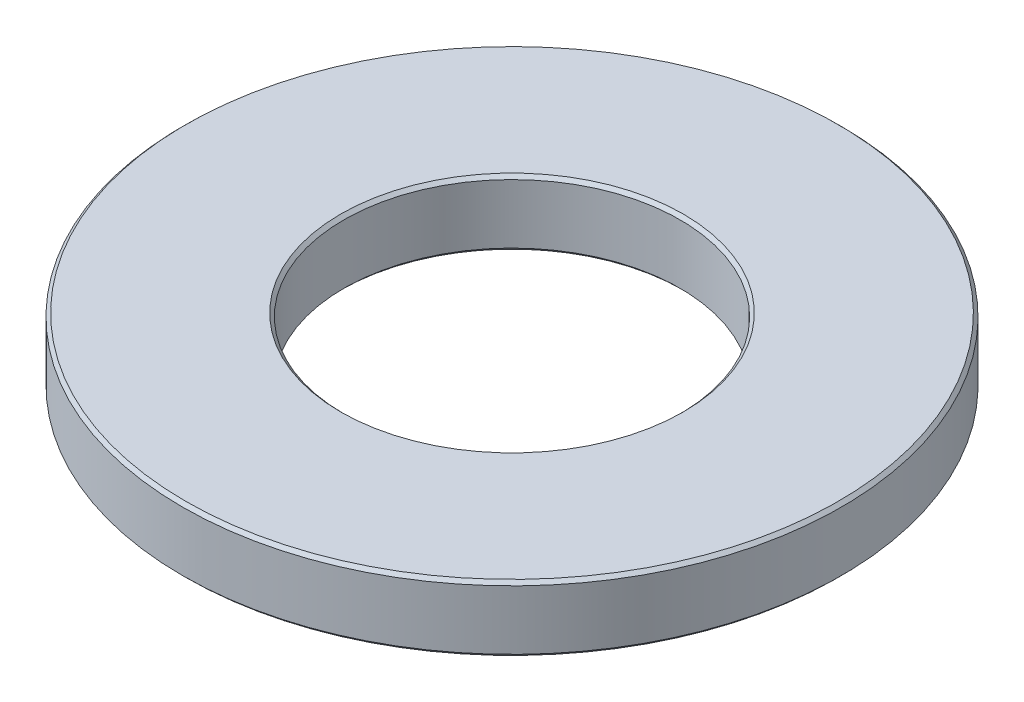
ISO-10303-21;
HEADER;
FILE_DESCRIPTION(('STEP AP214'),'2;1');
FILE_NAME('part.step','',(''),(''),'','','');
FILE_SCHEMA(('AUTOMOTIVE_DESIGN { 1 0 10303 214 1 1 1 1 }'));
ENDSEC;
DATA;
#1=APPLICATION_CONTEXT('core data for automotive mechanical design processes');
#2=APPLICATION_PROTOCOL_DEFINITION('international standard','automotive_design',2000,#1);
#3=PRODUCT_CONTEXT('',#1,'mechanical');
#4=PRODUCT('Part','Part','',(#3));
#5=PRODUCT_RELATED_PRODUCT_CATEGORY('part','',(#4));
#6=PRODUCT_DEFINITION_FORMATION('','',#4);
#7=PRODUCT_DEFINITION_CONTEXT('part definition',#1,'design');
#8=PRODUCT_DEFINITION('design','',#6,#7);
#9=PRODUCT_DEFINITION_SHAPE('','',#8);
#10=(LENGTH_UNIT() NAMED_UNIT(*) SI_UNIT(.MILLI.,.METRE.));
#11=(NAMED_UNIT(*) PLANE_ANGLE_UNIT() SI_UNIT($,.RADIAN.));
#12=(NAMED_UNIT(*) SI_UNIT($,.STERADIAN.) SOLID_ANGLE_UNIT());
#13=UNCERTAINTY_MEASURE_WITH_UNIT(LENGTH_MEASURE(1.E-05),#10,'distance_accuracy_value','');
#14=(GEOMETRIC_REPRESENTATION_CONTEXT(3) GLOBAL_UNCERTAINTY_ASSIGNED_CONTEXT((#13)) GLOBAL_UNIT_ASSIGNED_CONTEXT((#10,
#11,#12)) REPRESENTATION_CONTEXT('',''));
#15=CARTESIAN_POINT('',(0.,0.,0.));
#16=DIRECTION('',(0.,0.,1.));
#17=DIRECTION('',(1.,0.,0.));
#18=AXIS2_PLACEMENT_3D('',#15,#16,#17);
#19=CARTESIAN_POINT('',(0.,2.,0.));
#20=DIRECTION('',(0.,1.,0.));
#21=DIRECTION('',(0.,0.,1.));
#22=AXIS2_PLACEMENT_3D('',#19,#20,#21);
#23=PLANE('',#22);
#24=CARTESIAN_POINT('',(0.,2.,0.));
#25=DIRECTION('',(0.,1.,0.));
#26=DIRECTION('',(0.,0.,1.));
#27=AXIS2_PLACEMENT_3D('',#24,#25,#26);
#28=CIRCLE('',#27,5.2);
#29=CARTESIAN_POINT('',(0.,2.,5.2));
#30=VERTEX_POINT('',#29);
#31=EDGE_CURVE('E49',#30,#30,#28,.F.);
#32=ORIENTED_EDGE('',*,*,#31,.T.);
#33=EDGE_LOOP('',(#32));
#34=FACE_BOUND('',#33,.T.);
#35=CARTESIAN_POINT('',(0.,2.,0.));
#36=DIRECTION('',(0.,1.,0.));
#37=DIRECTION('',(0.,0.,1.));
#38=AXIS2_PLACEMENT_3D('',#35,#36,#37);
#39=CIRCLE('',#38,9.9);
#40=CARTESIAN_POINT('',(0.,2.,9.9));
#41=VERTEX_POINT('',#40);
#42=EDGE_CURVE('E52',#41,#41,#39,.T.);
#43=ORIENTED_EDGE('',*,*,#42,.T.);
#44=EDGE_LOOP('',(#43));
#45=FACE_BOUND('',#44,.T.);
#46=ADVANCED_FACE('F29',(#34,#45),#23,.T.);
#47=CARTESIAN_POINT('',(0.,0.,0.));
#48=DIRECTION('',(0.,1.,0.));
#49=DIRECTION('',(0.,0.,1.));
#50=AXIS2_PLACEMENT_3D('',#47,#48,#49);
#51=PLANE('',#50);
#52=CARTESIAN_POINT('',(0.,0.,0.));
#53=DIRECTION('',(0.,1.,0.));
#54=DIRECTION('',(0.,0.,1.));
#55=AXIS2_PLACEMENT_3D('',#52,#53,#54);
#56=CIRCLE('',#55,9.9);
#57=CARTESIAN_POINT('',(0.,0.,9.9));
#58=VERTEX_POINT('',#57);
#59=EDGE_CURVE('E10',#58,#58,#56,.F.);
#60=ORIENTED_EDGE('',*,*,#59,.T.);
#61=EDGE_LOOP('',(#60));
#62=FACE_BOUND('',#61,.T.);
#63=CARTESIAN_POINT('',(0.,0.,0.));
#64=DIRECTION('',(0.,1.,0.));
#65=DIRECTION('',(0.,0.,1.));
#66=AXIS2_PLACEMENT_3D('',#63,#64,#65);
#67=CIRCLE('',#66,5.2);
#68=CARTESIAN_POINT('',(0.,0.,5.2));
#69=VERTEX_POINT('',#68);
#70=EDGE_CURVE('E36',#69,#69,#67,.T.);
#71=ORIENTED_EDGE('',*,*,#70,.T.);
#72=EDGE_LOOP('',(#71));
#73=FACE_BOUND('',#72,.T.);
#74=ADVANCED_FACE('F76',(#62,#73),#51,.F.);
#75=CARTESIAN_POINT('',(0.,2.,0.));
#76=DIRECTION('',(0.,-1.,0.));
#77=DIRECTION('',(0.,0.,-1.));
#78=AXIS2_PLACEMENT_3D('',#75,#76,#77);
#79=CYLINDRICAL_SURFACE('',#78,10.);
#80=CARTESIAN_POINT('',(0.,1.9,0.));
#81=DIRECTION('',(0.,1.,0.));
#82=DIRECTION('',(0.,0.,1.));
#83=AXIS2_PLACEMENT_3D('',#80,#81,#82);
#84=CIRCLE('',#83,10.);
#85=CARTESIAN_POINT('',(0.,1.9,10.));
#86=VERTEX_POINT('',#85);
#87=EDGE_CURVE('E40',#86,#86,#84,.F.);
#88=ORIENTED_EDGE('',*,*,#87,.T.);
#89=EDGE_LOOP('',(#88));
#90=FACE_BOUND('',#89,.T.);
#91=CARTESIAN_POINT('',(0.,0.100000000000002,0.));
#92=DIRECTION('',(0.,1.,0.));
#93=DIRECTION('',(0.,0.,1.));
#94=AXIS2_PLACEMENT_3D('',#91,#92,#93);
#95=CIRCLE('',#94,10.);
#96=CARTESIAN_POINT('',(0.,0.100000000000002,10.));
#97=VERTEX_POINT('',#96);
#98=EDGE_CURVE('E44',#97,#97,#95,.T.);
#99=ORIENTED_EDGE('',*,*,#98,.T.);
#100=EDGE_LOOP('',(#99));
#101=FACE_BOUND('',#100,.T.);
#102=ADVANCED_FACE('F31',(#90,#101),#79,.T.);
#103=CARTESIAN_POINT('',(0.,2.,0.));
#104=DIRECTION('',(0.,-1.,0.));
#105=DIRECTION('',(0.,0.,-1.));
#106=AXIS2_PLACEMENT_3D('',#103,#104,#105);
#107=CYLINDRICAL_SURFACE('',#106,5.1);
#108=CARTESIAN_POINT('',(0.,1.9,0.));
#109=DIRECTION('',(0.,1.,0.));
#110=DIRECTION('',(0.,0.,1.));
#111=AXIS2_PLACEMENT_3D('',#108,#109,#110);
#112=CIRCLE('',#111,5.1);
#113=CARTESIAN_POINT('',(0.,1.9,5.1));
#114=VERTEX_POINT('',#113);
#115=EDGE_CURVE('E55',#114,#114,#112,.T.);
#116=ORIENTED_EDGE('',*,*,#115,.T.);
#117=EDGE_LOOP('',(#116));
#118=FACE_BOUND('',#117,.T.);
#119=CARTESIAN_POINT('',(0.,0.100000000000001,0.));
#120=DIRECTION('',(0.,1.,0.));
#121=DIRECTION('',(0.,0.,1.));
#122=AXIS2_PLACEMENT_3D('',#119,#120,#121);
#123=CIRCLE('',#122,5.1);
#124=CARTESIAN_POINT('',(0.,0.100000000000001,5.1));
#125=VERTEX_POINT('',#124);
#126=EDGE_CURVE('E58',#125,#125,#123,.F.);
#127=ORIENTED_EDGE('',*,*,#126,.T.);
#128=EDGE_LOOP('',(#127));
#129=FACE_BOUND('',#128,.T.);
#130=ADVANCED_FACE('F62',(#118,#129),#107,.F.);
#131=CARTESIAN_POINT('',(0.,1.9,0.));
#132=DIRECTION('',(0.,1.,0.));
#133=DIRECTION('',(0.,0.,1.));
#134=AXIS2_PLACEMENT_3D('',#131,#132,#133);
#135=CONICAL_SURFACE('',#134,5.1,0.785398163397445);
#136=ORIENTED_EDGE('',*,*,#31,.F.);
#137=EDGE_LOOP('',(#136));
#138=FACE_BOUND('',#137,.T.);
#139=ORIENTED_EDGE('',*,*,#115,.F.);
#140=EDGE_LOOP('',(#139));
#141=FACE_BOUND('',#140,.T.);
#142=ADVANCED_FACE('F86',(#138,#141),#135,.F.);
#143=CARTESIAN_POINT('',(0.,2.,0.));
#144=DIRECTION('',(0.,-1.,0.));
#145=DIRECTION('',(0.,0.,-1.));
#146=AXIS2_PLACEMENT_3D('',#143,#144,#145);
#147=CONICAL_SURFACE('',#146,9.9,0.78539816339745);
#148=ORIENTED_EDGE('',*,*,#87,.F.);
#149=EDGE_LOOP('',(#148));
#150=FACE_BOUND('',#149,.T.);
#151=ORIENTED_EDGE('',*,*,#42,.F.);
#152=EDGE_LOOP('',(#151));
#153=FACE_BOUND('',#152,.T.);
#154=ADVANCED_FACE('F72',(#150,#153),#147,.T.);
#155=CARTESIAN_POINT('',(0.,0.100000000000002,0.));
#156=DIRECTION('',(0.,1.,0.));
#157=DIRECTION('',(0.,0.,1.));
#158=AXIS2_PLACEMENT_3D('',#155,#156,#157);
#159=CONICAL_SURFACE('',#158,10.,0.785398163397445);
#160=ORIENTED_EDGE('',*,*,#59,.F.);
#161=EDGE_LOOP('',(#160));
#162=FACE_BOUND('',#161,.T.);
#163=ORIENTED_EDGE('',*,*,#98,.F.);
#164=EDGE_LOOP('',(#163));
#165=FACE_BOUND('',#164,.T.);
#166=ADVANCED_FACE('F67',(#162,#165),#159,.T.);
#167=CARTESIAN_POINT('',(0.,0.,0.));
#168=DIRECTION('',(0.,-1.,0.));
#169=DIRECTION('',(0.,0.,-1.));
#170=AXIS2_PLACEMENT_3D('',#167,#168,#169);
#171=CONICAL_SURFACE('',#170,5.2,0.785398163397455);
#172=ORIENTED_EDGE('',*,*,#126,.F.);
#173=EDGE_LOOP('',(#172));
#174=FACE_BOUND('',#173,.T.);
#175=ORIENTED_EDGE('',*,*,#70,.F.);
#176=EDGE_LOOP('',(#175));
#177=FACE_BOUND('',#176,.T.);
#178=ADVANCED_FACE('F64',(#174,#177),#171,.F.);
#179=CLOSED_SHELL('',(#46,#74,#102,#130,#142,#154,#166,#178));
#180=MANIFOLD_SOLID_BREP('B2',#179);
#181=ADVANCED_BREP_SHAPE_REPRESENTATION('',(#18,#180),#14);
#182=SHAPE_DEFINITION_REPRESENTATION(#9,#181);
ENDSEC;
END-ISO-10303-21;
